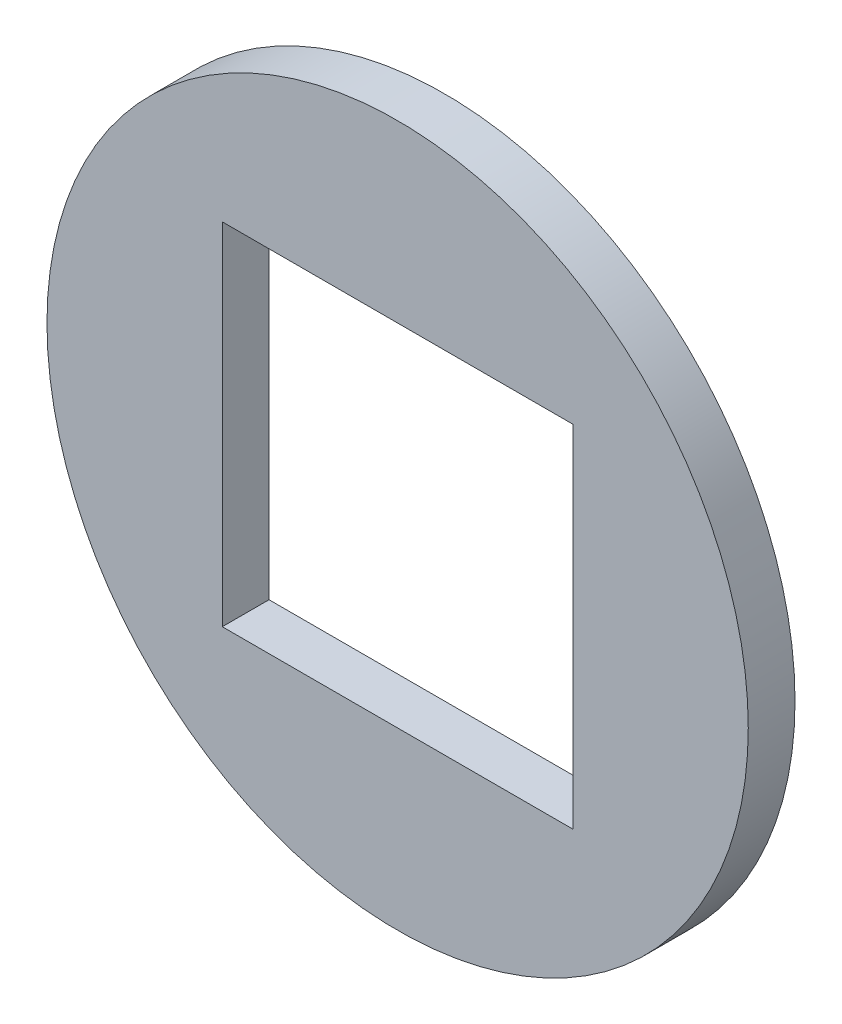
ISO-10303-21;
HEADER;
FILE_DESCRIPTION(('STEP AP214'),'2;1');
FILE_NAME('part.step','',(''),(''),'','','');
FILE_SCHEMA(('AUTOMOTIVE_DESIGN { 1 0 10303 214 1 1 1 1 }'));
ENDSEC;
DATA;
#1=APPLICATION_CONTEXT('core data for automotive mechanical design processes');
#2=APPLICATION_PROTOCOL_DEFINITION('international standard','automotive_design',2000,#1);
#3=PRODUCT_CONTEXT('',#1,'mechanical');
#4=PRODUCT('Part','Part','',(#3));
#5=PRODUCT_RELATED_PRODUCT_CATEGORY('part','',(#4));
#6=PRODUCT_DEFINITION_FORMATION('','',#4);
#7=PRODUCT_DEFINITION_CONTEXT('part definition',#1,'design');
#8=PRODUCT_DEFINITION('design','',#6,#7);
#9=PRODUCT_DEFINITION_SHAPE('','',#8);
#10=(LENGTH_UNIT() NAMED_UNIT(*) SI_UNIT(.MILLI.,.METRE.));
#11=(NAMED_UNIT(*) PLANE_ANGLE_UNIT() SI_UNIT($,.RADIAN.));
#12=(NAMED_UNIT(*) SI_UNIT($,.STERADIAN.) SOLID_ANGLE_UNIT());
#13=UNCERTAINTY_MEASURE_WITH_UNIT(LENGTH_MEASURE(1.E-05),#10,'distance_accuracy_value','');
#14=(GEOMETRIC_REPRESENTATION_CONTEXT(3) GLOBAL_UNCERTAINTY_ASSIGNED_CONTEXT((#13)) GLOBAL_UNIT_ASSIGNED_CONTEXT((#10,
#11,#12)) REPRESENTATION_CONTEXT('',''));
#15=CARTESIAN_POINT('',(0.,0.,0.));
#16=DIRECTION('',(0.,0.,1.));
#17=DIRECTION('',(1.,0.,0.));
#18=AXIS2_PLACEMENT_3D('',#15,#16,#17);
#19=CARTESIAN_POINT('',(0.,0.,2.));
#20=DIRECTION('',(0.,0.,1.));
#21=DIRECTION('',(1.,0.,0.));
#22=AXIS2_PLACEMENT_3D('',#19,#20,#21);
#23=PLANE('',#22);
#24=CARTESIAN_POINT('',(0.,0.,2.));
#25=DIRECTION('',(0.,0.,1.));
#26=DIRECTION('',(1.,0.,0.));
#27=AXIS2_PLACEMENT_3D('',#24,#25,#26);
#28=CIRCLE('',#27,15.);
#29=CARTESIAN_POINT('',(15.,0.,2.));
#30=VERTEX_POINT('',#29);
#31=EDGE_CURVE('E11',#30,#30,#28,.T.);
#32=ORIENTED_EDGE('',*,*,#31,.T.);
#33=EDGE_LOOP('',(#32));
#34=FACE_BOUND('',#33,.T.);
#35=DIRECTION('',(-1.,0.,0.));
#36=VECTOR('',#35,1.);
#37=CARTESIAN_POINT('',(-7.5,7.5,2.));
#38=LINE('',#37,#36);
#39=CARTESIAN_POINT('',(7.5,7.5,2.));
#40=VERTEX_POINT('',#39);
#41=CARTESIAN_POINT('',(-7.5,7.5,2.));
#42=VERTEX_POINT('',#41);
#43=EDGE_CURVE('E82',#40,#42,#38,.T.);
#44=ORIENTED_EDGE('',*,*,#43,.F.);
#45=DIRECTION('',(0.,1.,0.));
#46=VECTOR('',#45,1.);
#47=CARTESIAN_POINT('',(7.5,7.5,2.));
#48=LINE('',#47,#46);
#49=CARTESIAN_POINT('',(7.5,-7.5,2.));
#50=VERTEX_POINT('',#49);
#51=EDGE_CURVE('E74',#50,#40,#48,.T.);
#52=ORIENTED_EDGE('',*,*,#51,.F.);
#53=DIRECTION('',(1.,0.,0.));
#54=VECTOR('',#53,1.);
#55=CARTESIAN_POINT('',(-7.5,-7.5,2.));
#56=LINE('',#55,#54);
#57=CARTESIAN_POINT('',(-7.5,-7.5,2.));
#58=VERTEX_POINT('',#57);
#59=EDGE_CURVE('E95',#58,#50,#56,.T.);
#60=ORIENTED_EDGE('',*,*,#59,.F.);
#61=DIRECTION('',(0.,-1.,0.));
#62=VECTOR('',#61,1.);
#63=CARTESIAN_POINT('',(-7.5,7.5,2.));
#64=LINE('',#63,#62);
#65=EDGE_CURVE('E93',#42,#58,#64,.T.);
#66=ORIENTED_EDGE('',*,*,#65,.F.);
#67=EDGE_LOOP('',(#44,#52,#60,#66));
#68=FACE_BOUND('',#67,.T.);
#69=ADVANCED_FACE('F33',(#34,#68),#23,.T.);
#70=CARTESIAN_POINT('',(0.,0.,0.));
#71=DIRECTION('',(0.,0.,1.));
#72=DIRECTION('',(1.,0.,0.));
#73=AXIS2_PLACEMENT_3D('',#70,#71,#72);
#74=PLANE('',#73);
#75=CARTESIAN_POINT('',(0.,0.,0.));
#76=DIRECTION('',(0.,0.,1.));
#77=DIRECTION('',(1.,0.,0.));
#78=AXIS2_PLACEMENT_3D('',#75,#76,#77);
#79=CIRCLE('',#78,15.);
#80=CARTESIAN_POINT('',(15.,0.,0.));
#81=VERTEX_POINT('',#80);
#82=EDGE_CURVE('E37',#81,#81,#79,.T.);
#83=ORIENTED_EDGE('',*,*,#82,.F.);
#84=EDGE_LOOP('',(#83));
#85=FACE_BOUND('',#84,.T.);
#86=DIRECTION('',(0.,1.,0.));
#87=VECTOR('',#86,1.);
#88=CARTESIAN_POINT('',(7.5,7.5,0.));
#89=LINE('',#88,#87);
#90=CARTESIAN_POINT('',(7.5,-7.5,0.));
#91=VERTEX_POINT('',#90);
#92=CARTESIAN_POINT('',(7.5,7.5,0.));
#93=VERTEX_POINT('',#92);
#94=EDGE_CURVE('E56',#91,#93,#89,.T.);
#95=ORIENTED_EDGE('',*,*,#94,.T.);
#96=DIRECTION('',(-1.,0.,0.));
#97=VECTOR('',#96,1.);
#98=CARTESIAN_POINT('',(-7.5,7.5,0.));
#99=LINE('',#98,#97);
#100=CARTESIAN_POINT('',(-7.5,7.5,0.));
#101=VERTEX_POINT('',#100);
#102=EDGE_CURVE('E89',#93,#101,#99,.T.);
#103=ORIENTED_EDGE('',*,*,#102,.T.);
#104=DIRECTION('',(0.,-1.,0.));
#105=VECTOR('',#104,1.);
#106=CARTESIAN_POINT('',(-7.5,7.5,0.));
#107=LINE('',#106,#105);
#108=CARTESIAN_POINT('',(-7.5,-7.5,0.));
#109=VERTEX_POINT('',#108);
#110=EDGE_CURVE('E101',#101,#109,#107,.T.);
#111=ORIENTED_EDGE('',*,*,#110,.T.);
#112=DIRECTION('',(1.,0.,0.));
#113=VECTOR('',#112,1.);
#114=CARTESIAN_POINT('',(-7.5,-7.5,0.));
#115=LINE('',#114,#113);
#116=EDGE_CURVE('E83',#109,#91,#115,.T.);
#117=ORIENTED_EDGE('',*,*,#116,.T.);
#118=EDGE_LOOP('',(#95,#103,#111,#117));
#119=FACE_BOUND('',#118,.T.);
#120=ADVANCED_FACE('F112',(#85,#119),#74,.F.);
#121=CARTESIAN_POINT('',(0.,0.,2.));
#122=DIRECTION('',(0.,0.,-1.));
#123=DIRECTION('',(-1.,0.,0.));
#124=AXIS2_PLACEMENT_3D('',#121,#122,#123);
#125=CYLINDRICAL_SURFACE('',#124,15.);
#126=ORIENTED_EDGE('',*,*,#31,.F.);
#127=EDGE_LOOP('',(#126));
#128=FACE_BOUND('',#127,.T.);
#129=ORIENTED_EDGE('',*,*,#82,.T.);
#130=EDGE_LOOP('',(#129));
#131=FACE_BOUND('',#130,.T.);
#132=ADVANCED_FACE('F35',(#128,#131),#125,.T.);
#133=CARTESIAN_POINT('',(7.5,7.5,2.));
#134=DIRECTION('',(-1.,0.,0.));
#135=DIRECTION('',(0.,-1.,0.));
#136=AXIS2_PLACEMENT_3D('',#133,#134,#135);
#137=PLANE('',#136);
#138=ORIENTED_EDGE('',*,*,#94,.F.);
#139=DIRECTION('',(0.,0.,-1.));
#140=VECTOR('',#139,1.);
#141=CARTESIAN_POINT('',(7.5,-7.5,2.));
#142=LINE('',#141,#140);
#143=EDGE_CURVE('E78',#50,#91,#142,.T.);
#144=ORIENTED_EDGE('',*,*,#143,.F.);
#145=ORIENTED_EDGE('',*,*,#51,.T.);
#146=DIRECTION('',(0.,0.,-1.));
#147=VECTOR('',#146,1.);
#148=CARTESIAN_POINT('',(7.5,7.5,2.));
#149=LINE('',#148,#147);
#150=EDGE_CURVE('E77',#40,#93,#149,.T.);
#151=ORIENTED_EDGE('',*,*,#150,.T.);
#152=EDGE_LOOP('',(#138,#144,#145,#151));
#153=FACE_BOUND('',#152,.T.);
#154=ADVANCED_FACE('F76',(#153),#137,.T.);
#155=CARTESIAN_POINT('',(-7.5,7.5,2.));
#156=DIRECTION('',(0.,-1.,0.));
#157=DIRECTION('',(0.,0.,-1.));
#158=AXIS2_PLACEMENT_3D('',#155,#156,#157);
#159=PLANE('',#158);
#160=ORIENTED_EDGE('',*,*,#102,.F.);
#161=ORIENTED_EDGE('',*,*,#150,.F.);
#162=ORIENTED_EDGE('',*,*,#43,.T.);
#163=DIRECTION('',(0.,0.,-1.));
#164=VECTOR('',#163,1.);
#165=CARTESIAN_POINT('',(-7.5,7.5,2.));
#166=LINE('',#165,#164);
#167=EDGE_CURVE('E90',#42,#101,#166,.T.);
#168=ORIENTED_EDGE('',*,*,#167,.T.);
#169=EDGE_LOOP('',(#160,#161,#162,#168));
#170=FACE_BOUND('',#169,.T.);
#171=ADVANCED_FACE('F86',(#170),#159,.T.);
#172=CARTESIAN_POINT('',(-7.5,7.5,2.));
#173=DIRECTION('',(1.,0.,0.));
#174=DIRECTION('',(0.,1.,0.));
#175=AXIS2_PLACEMENT_3D('',#172,#173,#174);
#176=PLANE('',#175);
#177=ORIENTED_EDGE('',*,*,#110,.F.);
#178=ORIENTED_EDGE('',*,*,#167,.F.);
#179=ORIENTED_EDGE('',*,*,#65,.T.);
#180=DIRECTION('',(0.,0.,-1.));
#181=VECTOR('',#180,1.);
#182=CARTESIAN_POINT('',(-7.5,-7.5,2.));
#183=LINE('',#182,#181);
#184=EDGE_CURVE('E48',#58,#109,#183,.T.);
#185=ORIENTED_EDGE('',*,*,#184,.T.);
#186=EDGE_LOOP('',(#177,#178,#179,#185));
#187=FACE_BOUND('',#186,.T.);
#188=ADVANCED_FACE('F110',(#187),#176,.T.);
#189=CARTESIAN_POINT('',(-7.5,-7.5,2.));
#190=DIRECTION('',(0.,1.,0.));
#191=DIRECTION('',(0.,0.,1.));
#192=AXIS2_PLACEMENT_3D('',#189,#190,#191);
#193=PLANE('',#192);
#194=ORIENTED_EDGE('',*,*,#116,.F.);
#195=ORIENTED_EDGE('',*,*,#184,.F.);
#196=ORIENTED_EDGE('',*,*,#59,.T.);
#197=ORIENTED_EDGE('',*,*,#143,.T.);
#198=EDGE_LOOP('',(#194,#195,#196,#197));
#199=FACE_BOUND('',#198,.T.);
#200=ADVANCED_FACE('F113',(#199),#193,.T.);
#201=CLOSED_SHELL('',(#69,#120,#132,#154,#171,#188,#200));
#202=MANIFOLD_SOLID_BREP('B2',#201);
#203=ADVANCED_BREP_SHAPE_REPRESENTATION('',(#18,#202),#14);
#204=SHAPE_DEFINITION_REPRESENTATION(#9,#203);
ENDSEC;
END-ISO-10303-21;
